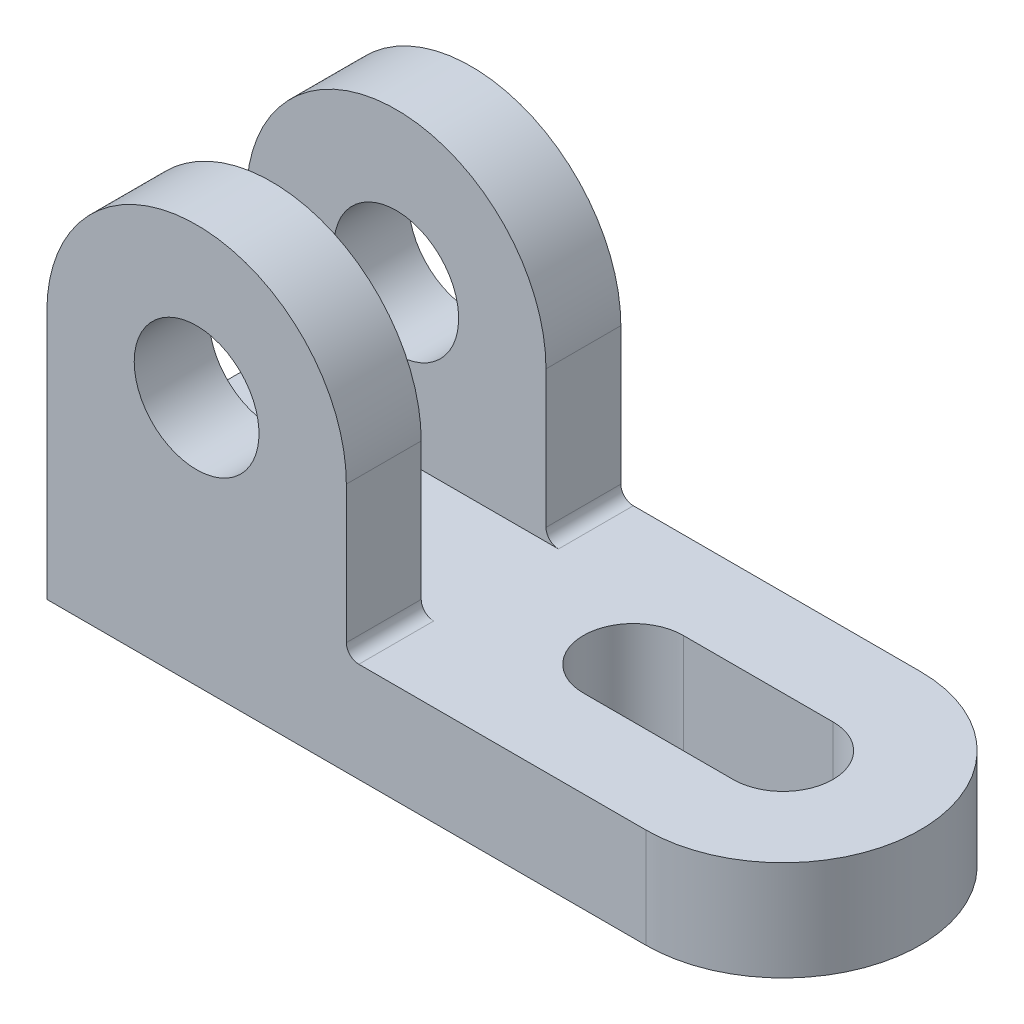
ISO-10303-21;
HEADER;
FILE_DESCRIPTION(('STEP AP214'),'2;1');
FILE_NAME('part.step','',(''),(''),'','','');
FILE_SCHEMA(('AUTOMOTIVE_DESIGN { 1 0 10303 214 1 1 1 1 }'));
ENDSEC;
DATA;
#1=APPLICATION_CONTEXT('core data for automotive mechanical design processes');
#2=APPLICATION_PROTOCOL_DEFINITION('international standard','automotive_design',2000,#1);
#3=PRODUCT_CONTEXT('',#1,'mechanical');
#4=PRODUCT('Part','Part','',(#3));
#5=PRODUCT_RELATED_PRODUCT_CATEGORY('part','',(#4));
#6=PRODUCT_DEFINITION_FORMATION('','',#4);
#7=PRODUCT_DEFINITION_CONTEXT('part definition',#1,'design');
#8=PRODUCT_DEFINITION('design','',#6,#7);
#9=PRODUCT_DEFINITION_SHAPE('','',#8);
#10=(LENGTH_UNIT() NAMED_UNIT(*) SI_UNIT(.MILLI.,.METRE.));
#11=(NAMED_UNIT(*) PLANE_ANGLE_UNIT() SI_UNIT($,.RADIAN.));
#12=(NAMED_UNIT(*) SI_UNIT($,.STERADIAN.) SOLID_ANGLE_UNIT());
#13=UNCERTAINTY_MEASURE_WITH_UNIT(LENGTH_MEASURE(1.E-05),#10,'distance_accuracy_value','');
#14=(GEOMETRIC_REPRESENTATION_CONTEXT(3) GLOBAL_UNCERTAINTY_ASSIGNED_CONTEXT((#13)) GLOBAL_UNIT_ASSIGNED_CONTEXT((#10,
#11,#12)) REPRESENTATION_CONTEXT('',''));
#15=CARTESIAN_POINT('',(0.,0.,0.));
#16=DIRECTION('',(0.,0.,1.));
#17=DIRECTION('',(1.,0.,0.));
#18=AXIS2_PLACEMENT_3D('',#15,#16,#17);
#19=CARTESIAN_POINT('',(48.,16.,0.));
#20=DIRECTION('',(0.,1.,0.));
#21=DIRECTION('',(0.,0.,1.));
#22=AXIS2_PLACEMENT_3D('',#19,#20,#21);
#23=PLANE('',#22);
#24=DIRECTION('',(-1.,0.,0.));
#25=VECTOR('',#24,1.);
#26=CARTESIAN_POINT('',(48.,16.,-7.99999999999999));
#27=LINE('',#26,#25);
#28=CARTESIAN_POINT('',(48.,16.,-7.99999999999999));
#29=VERTEX_POINT('',#28);
#30=CARTESIAN_POINT('',(24.,16.,-8.00000000000001));
#31=VERTEX_POINT('',#30);
#32=EDGE_CURVE('E227',#29,#31,#27,.T.);
#33=ORIENTED_EDGE('',*,*,#32,.F.);
#34=CARTESIAN_POINT('',(48.,16.,0.));
#35=DIRECTION('',(0.,1.,0.));
#36=DIRECTION('',(0.,0.,1.));
#37=AXIS2_PLACEMENT_3D('',#34,#35,#36);
#38=CIRCLE('',#37,8.);
#39=CARTESIAN_POINT('',(48.,16.,8.00000000000001));
#40=VERTEX_POINT('',#39);
#41=EDGE_CURVE('E225',#40,#29,#38,.T.);
#42=ORIENTED_EDGE('',*,*,#41,.F.);
#43=DIRECTION('',(1.,0.,0.));
#44=VECTOR('',#43,1.);
#45=CARTESIAN_POINT('',(48.,16.,8.00000000000001));
#46=LINE('',#45,#44);
#47=CARTESIAN_POINT('',(24.,16.,8.));
#48=VERTEX_POINT('',#47);
#49=EDGE_CURVE('E233',#48,#40,#46,.T.);
#50=ORIENTED_EDGE('',*,*,#49,.F.);
#51=CARTESIAN_POINT('',(24.,16.,0.));
#52=DIRECTION('',(0.,1.,0.));
#53=DIRECTION('',(0.,0.,1.));
#54=AXIS2_PLACEMENT_3D('',#51,#52,#53);
#55=CIRCLE('',#54,8.);
#56=EDGE_CURVE('E230',#31,#48,#55,.T.);
#57=ORIENTED_EDGE('',*,*,#56,.F.);
#58=EDGE_LOOP('',(#33,#42,#50,#57));
#59=FACE_BOUND('',#58,.T.);
#60=DIRECTION('',(-1.,0.,0.));
#61=VECTOR('',#60,1.);
#62=CARTESIAN_POINT('',(-48.,16.,-22.));
#63=LINE('',#62,#61);
#64=CARTESIAN_POINT('',(48.,16.,-22.));
#65=VERTEX_POINT('',#64);
#66=CARTESIAN_POINT('',(2.,16.,-22.));
#67=VERTEX_POINT('',#66);
#68=EDGE_CURVE('E54',#65,#67,#63,.T.);
#69=ORIENTED_EDGE('',*,*,#68,.T.);
#70=DIRECTION('',(0.,0.,-1.));
#71=VECTOR('',#70,1.);
#72=CARTESIAN_POINT('',(2.00000000000001,16.,-10.));
#73=LINE('',#72,#71);
#74=CARTESIAN_POINT('',(2.00000000000002,16.,-10.));
#75=VERTEX_POINT('',#74);
#76=EDGE_CURVE('E49',#75,#67,#73,.T.);
#77=ORIENTED_EDGE('',*,*,#76,.F.);
#78=DIRECTION('',(-1.,0.,0.));
#79=VECTOR('',#78,1.);
#80=CARTESIAN_POINT('',(0.,16.,-10.));
#81=LINE('',#80,#79);
#82=CARTESIAN_POINT('',(-48.,16.,-10.));
#83=VERTEX_POINT('',#82);
#84=EDGE_CURVE('E157',#75,#83,#81,.T.);
#85=ORIENTED_EDGE('',*,*,#84,.T.);
#86=DIRECTION('',(0.,0.,1.));
#87=VECTOR('',#86,1.);
#88=CARTESIAN_POINT('',(-48.,16.,-22.));
#89=LINE('',#88,#87);
#90=CARTESIAN_POINT('',(-48.,16.,9.99999999999999));
#91=VERTEX_POINT('',#90);
#92=EDGE_CURVE('E170',#83,#91,#89,.T.);
#93=ORIENTED_EDGE('',*,*,#92,.T.);
#94=DIRECTION('',(1.,0.,0.));
#95=VECTOR('',#94,1.);
#96=CARTESIAN_POINT('',(-48.,16.,9.99999999999999));
#97=LINE('',#96,#95);
#98=CARTESIAN_POINT('',(2.00000000000002,16.,9.99999999999999));
#99=VERTEX_POINT('',#98);
#100=EDGE_CURVE('E195',#91,#99,#97,.T.);
#101=ORIENTED_EDGE('',*,*,#100,.T.);
#102=DIRECTION('',(0.,0.,1.));
#103=VECTOR('',#102,1.);
#104=CARTESIAN_POINT('',(2.00000000000001,16.,9.99999999999999));
#105=LINE('',#104,#103);
#106=CARTESIAN_POINT('',(2.00000000000001,16.,22.));
#107=VERTEX_POINT('',#106);
#108=EDGE_CURVE('E207',#99,#107,#105,.T.);
#109=ORIENTED_EDGE('',*,*,#108,.T.);
#110=DIRECTION('',(1.,0.,0.));
#111=VECTOR('',#110,1.);
#112=CARTESIAN_POINT('',(-48.,16.,22.));
#113=LINE('',#112,#111);
#114=CARTESIAN_POINT('',(48.,16.,22.));
#115=VERTEX_POINT('',#114);
#116=EDGE_CURVE('E261',#107,#115,#113,.T.);
#117=ORIENTED_EDGE('',*,*,#116,.T.);
#118=CARTESIAN_POINT('',(48.,16.,0.));
#119=DIRECTION('',(0.,1.,0.));
#120=DIRECTION('',(0.,0.,1.));
#121=AXIS2_PLACEMENT_3D('',#118,#119,#120);
#122=CIRCLE('',#121,22.);
#123=EDGE_CURVE('E256',#115,#65,#122,.T.);
#124=ORIENTED_EDGE('',*,*,#123,.T.);
#125=EDGE_LOOP('',(#69,#77,#85,#93,#101,#109,#117,#124));
#126=FACE_BOUND('',#125,.T.);
#127=ADVANCED_FACE('F33',(#59,#126),#23,.T.);
#128=CARTESIAN_POINT('',(48.,0.,0.));
#129=DIRECTION('',(0.,1.,0.));
#130=DIRECTION('',(0.,0.,1.));
#131=AXIS2_PLACEMENT_3D('',#128,#129,#130);
#132=PLANE('',#131);
#133=CARTESIAN_POINT('',(48.,0.,0.));
#134=DIRECTION('',(0.,1.,0.));
#135=DIRECTION('',(0.,0.,1.));
#136=AXIS2_PLACEMENT_3D('',#133,#134,#135);
#137=CIRCLE('',#136,22.);
#138=CARTESIAN_POINT('',(48.,0.,22.));
#139=VERTEX_POINT('',#138);
#140=CARTESIAN_POINT('',(48.,0.,-22.));
#141=VERTEX_POINT('',#140);
#142=EDGE_CURVE('E255',#139,#141,#137,.T.);
#143=ORIENTED_EDGE('',*,*,#142,.F.);
#144=DIRECTION('',(1.,0.,0.));
#145=VECTOR('',#144,1.);
#146=CARTESIAN_POINT('',(-48.,0.,22.));
#147=LINE('',#146,#145);
#148=CARTESIAN_POINT('',(-48.,0.,22.));
#149=VERTEX_POINT('',#148);
#150=EDGE_CURVE('E258',#149,#139,#147,.T.);
#151=ORIENTED_EDGE('',*,*,#150,.F.);
#152=DIRECTION('',(0.,0.,1.));
#153=VECTOR('',#152,1.);
#154=CARTESIAN_POINT('',(-48.,0.,-22.));
#155=LINE('',#154,#153);
#156=CARTESIAN_POINT('',(-48.,0.,-22.));
#157=VERTEX_POINT('',#156);
#158=EDGE_CURVE('E268',#157,#149,#155,.T.);
#159=ORIENTED_EDGE('',*,*,#158,.F.);
#160=DIRECTION('',(-1.,0.,0.));
#161=VECTOR('',#160,1.);
#162=CARTESIAN_POINT('',(-48.,0.,-22.));
#163=LINE('',#162,#161);
#164=EDGE_CURVE('E266',#141,#157,#163,.T.);
#165=ORIENTED_EDGE('',*,*,#164,.F.);
#166=EDGE_LOOP('',(#143,#151,#159,#165));
#167=FACE_BOUND('',#166,.T.);
#168=CARTESIAN_POINT('',(48.,0.,0.));
#169=DIRECTION('',(0.,1.,0.));
#170=DIRECTION('',(0.,0.,1.));
#171=AXIS2_PLACEMENT_3D('',#168,#169,#170);
#172=CIRCLE('',#171,8.);
#173=CARTESIAN_POINT('',(48.,0.,8.00000000000001));
#174=VERTEX_POINT('',#173);
#175=CARTESIAN_POINT('',(48.,0.,-7.99999999999999));
#176=VERTEX_POINT('',#175);
#177=EDGE_CURVE('E218',#174,#176,#172,.T.);
#178=ORIENTED_EDGE('',*,*,#177,.T.);
#179=DIRECTION('',(-1.,0.,0.));
#180=VECTOR('',#179,1.);
#181=CARTESIAN_POINT('',(48.,0.,-7.99999999999999));
#182=LINE('',#181,#180);
#183=CARTESIAN_POINT('',(24.,0.,-8.00000000000001));
#184=VERTEX_POINT('',#183);
#185=EDGE_CURVE('E238',#176,#184,#182,.T.);
#186=ORIENTED_EDGE('',*,*,#185,.T.);
#187=CARTESIAN_POINT('',(24.,0.,0.));
#188=DIRECTION('',(0.,1.,0.));
#189=DIRECTION('',(0.,0.,1.));
#190=AXIS2_PLACEMENT_3D('',#187,#188,#189);
#191=CIRCLE('',#190,8.);
#192=CARTESIAN_POINT('',(24.,0.,8.));
#193=VERTEX_POINT('',#192);
#194=EDGE_CURVE('E241',#184,#193,#191,.T.);
#195=ORIENTED_EDGE('',*,*,#194,.T.);
#196=DIRECTION('',(1.,0.,0.));
#197=VECTOR('',#196,1.);
#198=CARTESIAN_POINT('',(48.,0.,8.00000000000001));
#199=LINE('',#198,#197);
#200=EDGE_CURVE('E228',#193,#174,#199,.T.);
#201=ORIENTED_EDGE('',*,*,#200,.T.);
#202=EDGE_LOOP('',(#178,#186,#195,#201));
#203=FACE_BOUND('',#202,.T.);
#204=ADVANCED_FACE('F281',(#167,#203),#132,.F.);
#205=CARTESIAN_POINT('',(48.,16.,0.));
#206=DIRECTION('',(0.,-1.,0.));
#207=DIRECTION('',(0.,0.,-1.));
#208=AXIS2_PLACEMENT_3D('',#205,#206,#207);
#209=CYLINDRICAL_SURFACE('',#208,22.);
#210=ORIENTED_EDGE('',*,*,#142,.T.);
#211=DIRECTION('',(0.,-1.,0.));
#212=VECTOR('',#211,1.);
#213=CARTESIAN_POINT('',(48.,16.,-22.));
#214=LINE('',#213,#212);
#215=EDGE_CURVE('E11',#65,#141,#214,.T.);
#216=ORIENTED_EDGE('',*,*,#215,.F.);
#217=ORIENTED_EDGE('',*,*,#123,.F.);
#218=DIRECTION('',(0.,-1.,0.));
#219=VECTOR('',#218,1.);
#220=CARTESIAN_POINT('',(48.,16.,22.));
#221=LINE('',#220,#219);
#222=EDGE_CURVE('E263',#115,#139,#221,.T.);
#223=ORIENTED_EDGE('',*,*,#222,.T.);
#224=EDGE_LOOP('',(#210,#216,#217,#223));
#225=FACE_BOUND('',#224,.T.);
#226=ADVANCED_FACE('F35',(#225),#209,.T.);
#227=CARTESIAN_POINT('',(-48.,16.,-22.));
#228=DIRECTION('',(0.,0.,1.));
#229=DIRECTION('',(1.,0.,0.));
#230=AXIS2_PLACEMENT_3D('',#227,#228,#229);
#231=PLANE('',#230);
#232=CARTESIAN_POINT('',(-24.,40.,-22.));
#233=DIRECTION('',(0.,0.,-1.));
#234=DIRECTION('',(-1.,0.,0.));
#235=AXIS2_PLACEMENT_3D('',#232,#233,#234);
#236=CIRCLE('',#235,10.);
#237=CARTESIAN_POINT('',(-34.,40.,-22.));
#238=VERTEX_POINT('',#237);
#239=EDGE_CURVE('E344',#238,#238,#236,.T.);
#240=ORIENTED_EDGE('',*,*,#239,.F.);
#241=EDGE_LOOP('',(#240));
#242=FACE_BOUND('',#241,.T.);
#243=ORIENTED_EDGE('',*,*,#164,.T.);
#244=DIRECTION('',(0.,-1.,0.));
#245=VECTOR('',#244,1.);
#246=CARTESIAN_POINT('',(-48.,16.,-22.));
#247=LINE('',#246,#245);
#248=CARTESIAN_POINT('',(-48.,40.,-22.));
#249=VERTEX_POINT('',#248);
#250=EDGE_CURVE('E42',#249,#157,#247,.T.);
#251=ORIENTED_EDGE('',*,*,#250,.F.);
#252=CARTESIAN_POINT('',(-24.,40.,-22.));
#253=DIRECTION('',(0.,0.,-1.));
#254=DIRECTION('',(-1.,0.,0.));
#255=AXIS2_PLACEMENT_3D('',#252,#253,#254);
#256=CIRCLE('',#255,24.);
#257=CARTESIAN_POINT('',(0.,40.,-22.));
#258=VERTEX_POINT('',#257);
#259=EDGE_CURVE('E152',#249,#258,#256,.T.);
#260=ORIENTED_EDGE('',*,*,#259,.T.);
#261=DIRECTION('',(0.,-1.,0.));
#262=VECTOR('',#261,1.);
#263=CARTESIAN_POINT('',(0.,18.,-22.));
#264=LINE('',#263,#262);
#265=CARTESIAN_POINT('',(0.,18.,-22.));
#266=VERTEX_POINT('',#265);
#267=EDGE_CURVE('E174',#258,#266,#264,.T.);
#268=ORIENTED_EDGE('',*,*,#267,.T.);
#269=CARTESIAN_POINT('',(2.,18.,-22.));
#270=DIRECTION('',(0.,0.,1.));
#271=DIRECTION('',(1.,0.,0.));
#272=AXIS2_PLACEMENT_3D('',#269,#270,#271);
#273=CIRCLE('',#272,2.);
#274=EDGE_CURVE('E171',#266,#67,#273,.T.);
#275=ORIENTED_EDGE('',*,*,#274,.T.);
#276=ORIENTED_EDGE('',*,*,#68,.F.);
#277=ORIENTED_EDGE('',*,*,#215,.T.);
#278=EDGE_LOOP('',(#243,#251,#260,#268,#275,#276,#277));
#279=FACE_BOUND('',#278,.T.);
#280=ADVANCED_FACE('F312',(#242,#279),#231,.F.);
#281=CARTESIAN_POINT('',(-48.,16.,-22.));
#282=DIRECTION('',(1.,0.,0.));
#283=DIRECTION('',(0.,0.,-1.));
#284=AXIS2_PLACEMENT_3D('',#281,#282,#283);
#285=PLANE('',#284);
#286=ORIENTED_EDGE('',*,*,#158,.T.);
#287=DIRECTION('',(0.,-1.,0.));
#288=VECTOR('',#287,1.);
#289=CARTESIAN_POINT('',(-48.,16.,22.));
#290=LINE('',#289,#288);
#291=CARTESIAN_POINT('',(-48.,40.,22.));
#292=VERTEX_POINT('',#291);
#293=EDGE_CURVE('E273',#292,#149,#290,.T.);
#294=ORIENTED_EDGE('',*,*,#293,.F.);
#295=DIRECTION('',(0.,0.,1.));
#296=VECTOR('',#295,1.);
#297=CARTESIAN_POINT('',(-48.,40.,9.99999999999999));
#298=LINE('',#297,#296);
#299=CARTESIAN_POINT('',(-48.,40.,9.99999999999999));
#300=VERTEX_POINT('',#299);
#301=EDGE_CURVE('E215',#300,#292,#298,.T.);
#302=ORIENTED_EDGE('',*,*,#301,.F.);
#303=DIRECTION('',(0.,-1.,0.));
#304=VECTOR('',#303,1.);
#305=CARTESIAN_POINT('',(-48.,16.,9.99999999999999));
#306=LINE('',#305,#304);
#307=EDGE_CURVE('E193',#300,#91,#306,.T.);
#308=ORIENTED_EDGE('',*,*,#307,.T.);
#309=ORIENTED_EDGE('',*,*,#92,.F.);
#310=DIRECTION('',(0.,1.,0.));
#311=VECTOR('',#310,1.);
#312=CARTESIAN_POINT('',(-48.,16.,-10.));
#313=LINE('',#312,#311);
#314=CARTESIAN_POINT('',(-48.,40.,-10.));
#315=VERTEX_POINT('',#314);
#316=EDGE_CURVE('E163',#83,#315,#313,.T.);
#317=ORIENTED_EDGE('',*,*,#316,.T.);
#318=DIRECTION('',(0.,0.,-1.));
#319=VECTOR('',#318,1.);
#320=CARTESIAN_POINT('',(-48.,40.,-10.));
#321=LINE('',#320,#319);
#322=EDGE_CURVE('E147',#315,#249,#321,.T.);
#323=ORIENTED_EDGE('',*,*,#322,.T.);
#324=ORIENTED_EDGE('',*,*,#250,.T.);
#325=EDGE_LOOP('',(#286,#294,#302,#308,#309,#317,#323,#324));
#326=FACE_BOUND('',#325,.T.);
#327=ADVANCED_FACE('F168',(#326),#285,.F.);
#328=CARTESIAN_POINT('',(-48.,16.,22.));
#329=DIRECTION('',(0.,0.,-1.));
#330=DIRECTION('',(-1.,0.,0.));
#331=AXIS2_PLACEMENT_3D('',#328,#329,#330);
#332=PLANE('',#331);
#333=CARTESIAN_POINT('',(-24.,40.,22.));
#334=DIRECTION('',(0.,0.,-1.));
#335=DIRECTION('',(-1.,0.,0.));
#336=AXIS2_PLACEMENT_3D('',#333,#334,#335);
#337=CIRCLE('',#336,10.);
#338=CARTESIAN_POINT('',(-34.,40.,22.));
#339=VERTEX_POINT('',#338);
#340=EDGE_CURVE('E342',#339,#339,#337,.T.);
#341=ORIENTED_EDGE('',*,*,#340,.T.);
#342=EDGE_LOOP('',(#341));
#343=FACE_BOUND('',#342,.T.);
#344=ORIENTED_EDGE('',*,*,#150,.T.);
#345=ORIENTED_EDGE('',*,*,#222,.F.);
#346=ORIENTED_EDGE('',*,*,#116,.F.);
#347=CARTESIAN_POINT('',(2.,18.,22.));
#348=DIRECTION('',(0.,0.,-1.));
#349=DIRECTION('',(1.,0.,0.));
#350=AXIS2_PLACEMENT_3D('',#347,#348,#349);
#351=CIRCLE('',#350,2.);
#352=CARTESIAN_POINT('',(0.,18.,22.));
#353=VERTEX_POINT('',#352);
#354=EDGE_CURVE('E189',#107,#353,#351,.T.);
#355=ORIENTED_EDGE('',*,*,#354,.T.);
#356=DIRECTION('',(0.,1.,0.));
#357=VECTOR('',#356,1.);
#358=CARTESIAN_POINT('',(0.,18.,22.));
#359=LINE('',#358,#357);
#360=CARTESIAN_POINT('',(0.,40.,22.));
#361=VERTEX_POINT('',#360);
#362=EDGE_CURVE('E210',#353,#361,#359,.T.);
#363=ORIENTED_EDGE('',*,*,#362,.T.);
#364=CARTESIAN_POINT('',(-24.,40.,22.));
#365=DIRECTION('',(0.,0.,1.));
#366=DIRECTION('',(1.,0.,0.));
#367=AXIS2_PLACEMENT_3D('',#364,#365,#366);
#368=CIRCLE('',#367,24.);
#369=EDGE_CURVE('E196',#361,#292,#368,.T.);
#370=ORIENTED_EDGE('',*,*,#369,.T.);
#371=ORIENTED_EDGE('',*,*,#293,.T.);
#372=EDGE_LOOP('',(#344,#345,#346,#355,#363,#370,#371));
#373=FACE_BOUND('',#372,.T.);
#374=ADVANCED_FACE('F285',(#343,#373),#332,.F.);
#375=CARTESIAN_POINT('',(48.,16.,0.));
#376=DIRECTION('',(0.,-1.,0.));
#377=DIRECTION('',(0.,0.,-1.));
#378=AXIS2_PLACEMENT_3D('',#375,#376,#377);
#379=CYLINDRICAL_SURFACE('',#378,8.);
#380=ORIENTED_EDGE('',*,*,#177,.F.);
#381=DIRECTION('',(0.,-1.,0.));
#382=VECTOR('',#381,1.);
#383=CARTESIAN_POINT('',(48.,16.,8.00000000000001));
#384=LINE('',#383,#382);
#385=EDGE_CURVE('E235',#40,#174,#384,.T.);
#386=ORIENTED_EDGE('',*,*,#385,.F.);
#387=ORIENTED_EDGE('',*,*,#41,.T.);
#388=DIRECTION('',(0.,-1.,0.));
#389=VECTOR('',#388,1.);
#390=CARTESIAN_POINT('',(48.,16.,-7.99999999999999));
#391=LINE('',#390,#389);
#392=EDGE_CURVE('E252',#29,#176,#391,.T.);
#393=ORIENTED_EDGE('',*,*,#392,.T.);
#394=EDGE_LOOP('',(#380,#386,#387,#393));
#395=FACE_BOUND('',#394,.T.);
#396=ADVANCED_FACE('F330',(#395),#379,.F.);
#397=CARTESIAN_POINT('',(48.,16.,-7.99999999999999));
#398=DIRECTION('',(0.,0.,1.));
#399=DIRECTION('',(1.,0.,0.));
#400=AXIS2_PLACEMENT_3D('',#397,#398,#399);
#401=PLANE('',#400);
#402=ORIENTED_EDGE('',*,*,#185,.F.);
#403=ORIENTED_EDGE('',*,*,#392,.F.);
#404=ORIENTED_EDGE('',*,*,#32,.T.);
#405=DIRECTION('',(0.,-1.,0.));
#406=VECTOR('',#405,1.);
#407=CARTESIAN_POINT('',(24.,16.,-8.00000000000001));
#408=LINE('',#407,#406);
#409=EDGE_CURVE('E250',#31,#184,#408,.T.);
#410=ORIENTED_EDGE('',*,*,#409,.T.);
#411=EDGE_LOOP('',(#402,#403,#404,#410));
#412=FACE_BOUND('',#411,.T.);
#413=ADVANCED_FACE('F338',(#412),#401,.T.);
#414=CARTESIAN_POINT('',(24.,16.,0.));
#415=DIRECTION('',(0.,-1.,0.));
#416=DIRECTION('',(0.,0.,-1.));
#417=AXIS2_PLACEMENT_3D('',#414,#415,#416);
#418=CYLINDRICAL_SURFACE('',#417,8.);
#419=ORIENTED_EDGE('',*,*,#194,.F.);
#420=ORIENTED_EDGE('',*,*,#409,.F.);
#421=ORIENTED_EDGE('',*,*,#56,.T.);
#422=DIRECTION('',(0.,-1.,0.));
#423=VECTOR('',#422,1.);
#424=CARTESIAN_POINT('',(24.,16.,8.));
#425=LINE('',#424,#423);
#426=EDGE_CURVE('E248',#48,#193,#425,.T.);
#427=ORIENTED_EDGE('',*,*,#426,.T.);
#428=EDGE_LOOP('',(#419,#420,#421,#427));
#429=FACE_BOUND('',#428,.T.);
#430=ADVANCED_FACE('F379',(#429),#418,.F.);
#431=CARTESIAN_POINT('',(48.,16.,8.00000000000001));
#432=DIRECTION('',(0.,0.,-1.));
#433=DIRECTION('',(-1.,0.,0.));
#434=AXIS2_PLACEMENT_3D('',#431,#432,#433);
#435=PLANE('',#434);
#436=ORIENTED_EDGE('',*,*,#200,.F.);
#437=ORIENTED_EDGE('',*,*,#426,.F.);
#438=ORIENTED_EDGE('',*,*,#49,.T.);
#439=ORIENTED_EDGE('',*,*,#385,.T.);
#440=EDGE_LOOP('',(#436,#437,#438,#439));
#441=FACE_BOUND('',#440,.T.);
#442=ADVANCED_FACE('F372',(#441),#435,.T.);
#443=CARTESIAN_POINT('',(-24.,40.,9.99999999999999));
#444=DIRECTION('',(0.,0.,1.));
#445=DIRECTION('',(1.,0.,0.));
#446=AXIS2_PLACEMENT_3D('',#443,#444,#445);
#447=CYLINDRICAL_SURFACE('',#446,24.);
#448=ORIENTED_EDGE('',*,*,#369,.F.);
#449=DIRECTION('',(0.,0.,1.));
#450=VECTOR('',#449,1.);
#451=CARTESIAN_POINT('',(0.,40.,9.99999999999999));
#452=LINE('',#451,#450);
#453=CARTESIAN_POINT('',(0.,40.,9.99999999999999));
#454=VERTEX_POINT('',#453);
#455=EDGE_CURVE('E219',#454,#361,#452,.T.);
#456=ORIENTED_EDGE('',*,*,#455,.F.);
#457=CARTESIAN_POINT('',(-24.,40.,9.99999999999999));
#458=DIRECTION('',(0.,0.,1.));
#459=DIRECTION('',(1.,0.,0.));
#460=AXIS2_PLACEMENT_3D('',#457,#458,#459);
#461=CIRCLE('',#460,24.);
#462=EDGE_CURVE('E204',#454,#300,#461,.T.);
#463=ORIENTED_EDGE('',*,*,#462,.T.);
#464=ORIENTED_EDGE('',*,*,#301,.T.);
#465=EDGE_LOOP('',(#448,#456,#463,#464));
#466=FACE_BOUND('',#465,.T.);
#467=ADVANCED_FACE('F301',(#466),#447,.T.);
#468=CARTESIAN_POINT('',(0.,18.,9.99999999999999));
#469=DIRECTION('',(1.,0.,0.));
#470=DIRECTION('',(0.,0.,-1.));
#471=AXIS2_PLACEMENT_3D('',#468,#469,#470);
#472=PLANE('',#471);
#473=ORIENTED_EDGE('',*,*,#362,.F.);
#474=DIRECTION('',(0.,0.,1.));
#475=VECTOR('',#474,1.);
#476=CARTESIAN_POINT('',(0.,18.,9.99999999999999));
#477=LINE('',#476,#475);
#478=CARTESIAN_POINT('',(0.,18.,9.99999999999999));
#479=VERTEX_POINT('',#478);
#480=EDGE_CURVE('E221',#479,#353,#477,.T.);
#481=ORIENTED_EDGE('',*,*,#480,.F.);
#482=DIRECTION('',(0.,1.,0.));
#483=VECTOR('',#482,1.);
#484=CARTESIAN_POINT('',(0.,18.,9.99999999999999));
#485=LINE('',#484,#483);
#486=EDGE_CURVE('E201',#479,#454,#485,.T.);
#487=ORIENTED_EDGE('',*,*,#486,.T.);
#488=ORIENTED_EDGE('',*,*,#455,.T.);
#489=EDGE_LOOP('',(#473,#481,#487,#488));
#490=FACE_BOUND('',#489,.T.);
#491=ADVANCED_FACE('F298',(#490),#472,.T.);
#492=CARTESIAN_POINT('',(2.,18.,9.99999999999999));
#493=DIRECTION('',(0.,0.,1.));
#494=DIRECTION('',(1.,0.,0.));
#495=AXIS2_PLACEMENT_3D('',#492,#493,#494);
#496=CYLINDRICAL_SURFACE('',#495,2.);
#497=ORIENTED_EDGE('',*,*,#354,.F.);
#498=ORIENTED_EDGE('',*,*,#108,.F.);
#499=CARTESIAN_POINT('',(2.,18.,9.99999999999999));
#500=DIRECTION('',(0.,0.,-1.));
#501=DIRECTION('',(1.,0.,0.));
#502=AXIS2_PLACEMENT_3D('',#499,#500,#501);
#503=CIRCLE('',#502,2.);
#504=EDGE_CURVE('E198',#99,#479,#503,.T.);
#505=ORIENTED_EDGE('',*,*,#504,.T.);
#506=ORIENTED_EDGE('',*,*,#480,.T.);
#507=EDGE_LOOP('',(#497,#498,#505,#506));
#508=FACE_BOUND('',#507,.T.);
#509=ADVANCED_FACE('F294',(#508),#496,.F.);
#510=CARTESIAN_POINT('',(-24.,40.,9.99999999999999));
#511=DIRECTION('',(0.,0.,1.));
#512=DIRECTION('',(1.,0.,0.));
#513=AXIS2_PLACEMENT_3D('',#510,#511,#512);
#514=PLANE('',#513);
#515=CARTESIAN_POINT('',(-24.,40.,9.99999999999999));
#516=DIRECTION('',(0.,0.,1.));
#517=DIRECTION('',(1.,0.,0.));
#518=AXIS2_PLACEMENT_3D('',#515,#516,#517);
#519=CIRCLE('',#518,10.);
#520=CARTESIAN_POINT('',(-14.,40.,9.99999999999999));
#521=VERTEX_POINT('',#520);
#522=EDGE_CURVE('E177',#521,#521,#519,.T.);
#523=ORIENTED_EDGE('',*,*,#522,.T.);
#524=EDGE_LOOP('',(#523));
#525=FACE_BOUND('',#524,.T.);
#526=ORIENTED_EDGE('',*,*,#307,.F.);
#527=ORIENTED_EDGE('',*,*,#462,.F.);
#528=ORIENTED_EDGE('',*,*,#486,.F.);
#529=ORIENTED_EDGE('',*,*,#504,.F.);
#530=ORIENTED_EDGE('',*,*,#100,.F.);
#531=EDGE_LOOP('',(#526,#527,#528,#529,#530));
#532=FACE_BOUND('',#531,.T.);
#533=ADVANCED_FACE('F305',(#525,#532),#514,.F.);
#534=CARTESIAN_POINT('',(2.,18.,-10.));
#535=DIRECTION('',(0.,0.,-1.));
#536=DIRECTION('',(-1.,0.,0.));
#537=AXIS2_PLACEMENT_3D('',#534,#535,#536);
#538=CYLINDRICAL_SURFACE('',#537,2.);
#539=ORIENTED_EDGE('',*,*,#274,.F.);
#540=DIRECTION('',(0.,0.,-1.));
#541=VECTOR('',#540,1.);
#542=CARTESIAN_POINT('',(0.,18.,-10.));
#543=LINE('',#542,#541);
#544=CARTESIAN_POINT('',(0.,18.,-10.));
#545=VERTEX_POINT('',#544);
#546=EDGE_CURVE('E190',#545,#266,#543,.T.);
#547=ORIENTED_EDGE('',*,*,#546,.F.);
#548=CARTESIAN_POINT('',(2.,18.,-10.));
#549=DIRECTION('',(0.,0.,1.));
#550=DIRECTION('',(1.,0.,0.));
#551=AXIS2_PLACEMENT_3D('',#548,#549,#550);
#552=CIRCLE('',#551,2.);
#553=EDGE_CURVE('E181',#545,#75,#552,.T.);
#554=ORIENTED_EDGE('',*,*,#553,.T.);
#555=ORIENTED_EDGE('',*,*,#76,.T.);
#556=EDGE_LOOP('',(#539,#547,#554,#555));
#557=FACE_BOUND('',#556,.T.);
#558=ADVANCED_FACE('F308',(#557),#538,.F.);
#559=CARTESIAN_POINT('',(0.,18.,-10.));
#560=DIRECTION('',(1.,0.,0.));
#561=DIRECTION('',(0.,0.,-1.));
#562=AXIS2_PLACEMENT_3D('',#559,#560,#561);
#563=PLANE('',#562);
#564=ORIENTED_EDGE('',*,*,#267,.F.);
#565=DIRECTION('',(0.,0.,-1.));
#566=VECTOR('',#565,1.);
#567=CARTESIAN_POINT('',(0.,40.,-10.));
#568=LINE('',#567,#566);
#569=CARTESIAN_POINT('',(0.,40.,-10.));
#570=VERTEX_POINT('',#569);
#571=EDGE_CURVE('E156',#570,#258,#568,.T.);
#572=ORIENTED_EDGE('',*,*,#571,.F.);
#573=DIRECTION('',(0.,-1.,0.));
#574=VECTOR('',#573,1.);
#575=CARTESIAN_POINT('',(0.,18.,-10.));
#576=LINE('',#575,#574);
#577=EDGE_CURVE('E166',#570,#545,#576,.T.);
#578=ORIENTED_EDGE('',*,*,#577,.T.);
#579=ORIENTED_EDGE('',*,*,#546,.T.);
#580=EDGE_LOOP('',(#564,#572,#578,#579));
#581=FACE_BOUND('',#580,.T.);
#582=ADVANCED_FACE('F311',(#581),#563,.T.);
#583=CARTESIAN_POINT('',(-24.,40.,-10.));
#584=DIRECTION('',(0.,0.,-1.));
#585=DIRECTION('',(-1.,0.,0.));
#586=AXIS2_PLACEMENT_3D('',#583,#584,#585);
#587=CYLINDRICAL_SURFACE('',#586,24.);
#588=ORIENTED_EDGE('',*,*,#259,.F.);
#589=ORIENTED_EDGE('',*,*,#322,.F.);
#590=CARTESIAN_POINT('',(-24.,40.,-10.));
#591=DIRECTION('',(0.,0.,-1.));
#592=DIRECTION('',(-1.,0.,0.));
#593=AXIS2_PLACEMENT_3D('',#590,#591,#592);
#594=CIRCLE('',#593,24.);
#595=EDGE_CURVE('E150',#315,#570,#594,.T.);
#596=ORIENTED_EDGE('',*,*,#595,.T.);
#597=ORIENTED_EDGE('',*,*,#571,.T.);
#598=EDGE_LOOP('',(#588,#589,#596,#597));
#599=FACE_BOUND('',#598,.T.);
#600=ADVANCED_FACE('F149',(#599),#587,.T.);
#601=CARTESIAN_POINT('',(-24.,40.,-10.));
#602=DIRECTION('',(0.,0.,-1.));
#603=DIRECTION('',(-1.,0.,0.));
#604=AXIS2_PLACEMENT_3D('',#601,#602,#603);
#605=PLANE('',#604);
#606=CARTESIAN_POINT('',(-24.,40.,-10.));
#607=DIRECTION('',(0.,0.,-1.));
#608=DIRECTION('',(-1.,0.,0.));
#609=AXIS2_PLACEMENT_3D('',#606,#607,#608);
#610=CIRCLE('',#609,10.);
#611=CARTESIAN_POINT('',(-34.,40.,-10.));
#612=VERTEX_POINT('',#611);
#613=EDGE_CURVE('E37',#612,#612,#610,.T.);
#614=ORIENTED_EDGE('',*,*,#613,.T.);
#615=EDGE_LOOP('',(#614));
#616=FACE_BOUND('',#615,.T.);
#617=ORIENTED_EDGE('',*,*,#316,.F.);
#618=ORIENTED_EDGE('',*,*,#84,.F.);
#619=ORIENTED_EDGE('',*,*,#553,.F.);
#620=ORIENTED_EDGE('',*,*,#577,.F.);
#621=ORIENTED_EDGE('',*,*,#595,.F.);
#622=EDGE_LOOP('',(#617,#618,#619,#620,#621));
#623=FACE_BOUND('',#622,.T.);
#624=ADVANCED_FACE('F162',(#616,#623),#605,.F.);
#625=CARTESIAN_POINT('',(-24.,40.,22.));
#626=DIRECTION('',(0.,0.,-1.));
#627=DIRECTION('',(-1.,0.,0.));
#628=AXIS2_PLACEMENT_3D('',#625,#626,#627);
#629=CYLINDRICAL_SURFACE('',#628,10.);
#630=ORIENTED_EDGE('',*,*,#239,.T.);
#631=EDGE_LOOP('',(#630));
#632=FACE_BOUND('',#631,.T.);
#633=ORIENTED_EDGE('',*,*,#613,.F.);
#634=EDGE_LOOP('',(#633));
#635=FACE_BOUND('',#634,.T.);
#636=ADVANCED_FACE('F349',(#632,#635),#629,.F.);
#637=ORIENTED_EDGE('',*,*,#340,.F.);
#638=EDGE_LOOP('',(#637));
#639=FACE_BOUND('',#638,.T.);
#640=ORIENTED_EDGE('',*,*,#522,.F.);
#641=EDGE_LOOP('',(#640));
#642=FACE_BOUND('',#641,.T.);
#643=ADVANCED_FACE('F352',(#639,#642),#629,.F.);
#644=CLOSED_SHELL('',(#127,#204,#226,#280,#327,#374,#396,#413,#430,#442,#467,#491,#509,#533,
#558,#582,#600,#624,#636,#643));
#645=MANIFOLD_SOLID_BREP('B2',#644);
#646=ADVANCED_BREP_SHAPE_REPRESENTATION('',(#18,#645),#14);
#647=SHAPE_DEFINITION_REPRESENTATION(#9,#646);
ENDSEC;
END-ISO-10303-21;
